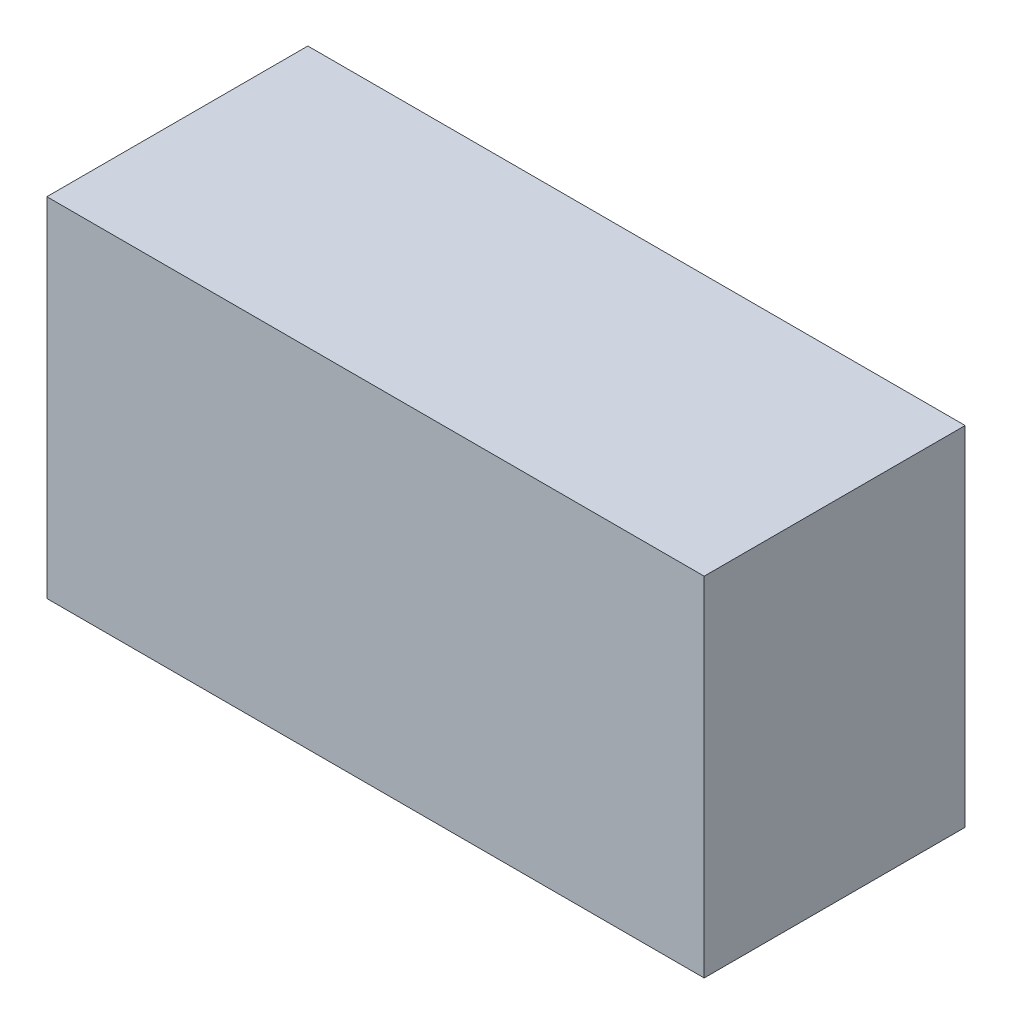
ISO-10303-21;
HEADER;
FILE_DESCRIPTION(('STEP AP214'),'2;1');
FILE_NAME('part.step','',(''),(''),'','','');
FILE_SCHEMA(('AUTOMOTIVE_DESIGN { 1 0 10303 214 1 1 1 1 }'));
ENDSEC;
DATA;
#1=APPLICATION_CONTEXT('core data for automotive mechanical design processes');
#2=APPLICATION_PROTOCOL_DEFINITION('international standard','automotive_design',2000,#1);
#3=PRODUCT_CONTEXT('',#1,'mechanical');
#4=PRODUCT('Part','Part','',(#3));
#5=PRODUCT_RELATED_PRODUCT_CATEGORY('part','',(#4));
#6=PRODUCT_DEFINITION_FORMATION('','',#4);
#7=PRODUCT_DEFINITION_CONTEXT('part definition',#1,'design');
#8=PRODUCT_DEFINITION('design','',#6,#7);
#9=PRODUCT_DEFINITION_SHAPE('','',#8);
#10=(LENGTH_UNIT() NAMED_UNIT(*) SI_UNIT(.MILLI.,.METRE.));
#11=(NAMED_UNIT(*) PLANE_ANGLE_UNIT() SI_UNIT($,.RADIAN.));
#12=(NAMED_UNIT(*) SI_UNIT($,.STERADIAN.) SOLID_ANGLE_UNIT());
#13=UNCERTAINTY_MEASURE_WITH_UNIT(LENGTH_MEASURE(1.E-05),#10,'distance_accuracy_value','');
#14=(GEOMETRIC_REPRESENTATION_CONTEXT(3) GLOBAL_UNCERTAINTY_ASSIGNED_CONTEXT((#13)) GLOBAL_UNIT_ASSIGNED_CONTEXT((#10,
#11,#12)) REPRESENTATION_CONTEXT('',''));
#15=CARTESIAN_POINT('',(0.,0.,0.));
#16=DIRECTION('',(0.,0.,1.));
#17=DIRECTION('',(1.,0.,0.));
#18=AXIS2_PLACEMENT_3D('',#15,#16,#17);
#19=CARTESIAN_POINT('',(-1.69999914,-0.90000074,1.35));
#20=DIRECTION('',(0.,0.,-1.));
#21=DIRECTION('',(-1.,0.,0.));
#22=AXIS2_PLACEMENT_3D('',#19,#20,#21);
#23=PLANE('',#22);
#24=DIRECTION('',(0.,1.,0.));
#25=VECTOR('',#24,1.);
#26=CARTESIAN_POINT('',(1.69999914,-0.90000074,1.35));
#27=LINE('',#26,#25);
#28=CARTESIAN_POINT('',(1.69999914,-0.90000074,1.35));
#29=VERTEX_POINT('',#28);
#30=CARTESIAN_POINT('',(1.69999914,0.90000074,1.35));
#31=VERTEX_POINT('',#30);
#32=EDGE_CURVE('E79',#29,#31,#27,.T.);
#33=ORIENTED_EDGE('',*,*,#32,.T.);
#34=DIRECTION('',(1.,0.,0.));
#35=VECTOR('',#34,1.);
#36=CARTESIAN_POINT('',(1.69999914,0.90000074,1.35));
#37=LINE('',#36,#35);
#38=CARTESIAN_POINT('',(-1.69999914,0.90000074,1.35));
#39=VERTEX_POINT('',#38);
#40=EDGE_CURVE('E55',#31,#39,#37,.F.);
#41=ORIENTED_EDGE('',*,*,#40,.T.);
#42=DIRECTION('',(0.,1.,0.));
#43=VECTOR('',#42,1.);
#44=CARTESIAN_POINT('',(-1.69999914,0.90000074,1.35));
#45=LINE('',#44,#43);
#46=CARTESIAN_POINT('',(-1.69999914,-0.90000074,1.35));
#47=VERTEX_POINT('',#46);
#48=EDGE_CURVE('E57',#39,#47,#45,.F.);
#49=ORIENTED_EDGE('',*,*,#48,.T.);
#50=DIRECTION('',(1.,0.,0.));
#51=VECTOR('',#50,1.);
#52=CARTESIAN_POINT('',(-1.69999914,-0.90000074,1.35));
#53=LINE('',#52,#51);
#54=EDGE_CURVE('E20',#47,#29,#53,.T.);
#55=ORIENTED_EDGE('',*,*,#54,.T.);
#56=EDGE_LOOP('',(#33,#41,#49,#55));
#57=FACE_BOUND('',#56,.T.);
#58=ADVANCED_FACE('F17',(#57),#23,.F.);
#59=CARTESIAN_POINT('',(-1.69999914,-0.90000074,0.));
#60=DIRECTION('',(0.,1.,0.));
#61=DIRECTION('',(0.,0.,1.));
#62=AXIS2_PLACEMENT_3D('',#59,#60,#61);
#63=PLANE('',#62);
#64=DIRECTION('',(-1.,0.,0.));
#65=VECTOR('',#64,1.);
#66=CARTESIAN_POINT('',(-1.69999914,-0.90000074,0.));
#67=LINE('',#66,#65);
#68=CARTESIAN_POINT('',(1.69999914,-0.90000074,0.));
#69=VERTEX_POINT('',#68);
#70=CARTESIAN_POINT('',(-1.69999914,-0.90000074,0.));
#71=VERTEX_POINT('',#70);
#72=EDGE_CURVE('E83',#69,#71,#67,.T.);
#73=ORIENTED_EDGE('',*,*,#72,.F.);
#74=DIRECTION('',(0.,0.,1.));
#75=VECTOR('',#74,1.);
#76=CARTESIAN_POINT('',(1.69999914,-0.90000074,0.));
#77=LINE('',#76,#75);
#78=EDGE_CURVE('E68',#69,#29,#77,.T.);
#79=ORIENTED_EDGE('',*,*,#78,.T.);
#80=ORIENTED_EDGE('',*,*,#54,.F.);
#81=DIRECTION('',(0.,0.,-1.));
#82=VECTOR('',#81,1.);
#83=CARTESIAN_POINT('',(-1.69999914,-0.90000074,0.));
#84=LINE('',#83,#82);
#85=EDGE_CURVE('E63',#47,#71,#84,.T.);
#86=ORIENTED_EDGE('',*,*,#85,.T.);
#87=EDGE_LOOP('',(#73,#79,#80,#86));
#88=FACE_BOUND('',#87,.T.);
#89=ADVANCED_FACE('F65',(#88),#63,.F.);
#90=CARTESIAN_POINT('',(-1.69999914,0.90000074,0.));
#91=DIRECTION('',(1.,0.,0.));
#92=DIRECTION('',(0.,0.,-1.));
#93=AXIS2_PLACEMENT_3D('',#90,#91,#92);
#94=PLANE('',#93);
#95=DIRECTION('',(0.,1.,0.));
#96=VECTOR('',#95,1.);
#97=CARTESIAN_POINT('',(-1.69999914,-0.90000074,0.));
#98=LINE('',#97,#96);
#99=CARTESIAN_POINT('',(-1.69999914,0.90000074,0.));
#100=VERTEX_POINT('',#99);
#101=EDGE_CURVE('E72',#71,#100,#98,.T.);
#102=ORIENTED_EDGE('',*,*,#101,.F.);
#103=ORIENTED_EDGE('',*,*,#85,.F.);
#104=ORIENTED_EDGE('',*,*,#48,.F.);
#105=DIRECTION('',(0.,0.,-1.));
#106=VECTOR('',#105,1.);
#107=CARTESIAN_POINT('',(-1.69999914,0.90000074,0.));
#108=LINE('',#107,#106);
#109=EDGE_CURVE('E75',#39,#100,#108,.T.);
#110=ORIENTED_EDGE('',*,*,#109,.T.);
#111=EDGE_LOOP('',(#102,#103,#104,#110));
#112=FACE_BOUND('',#111,.T.);
#113=ADVANCED_FACE('F70',(#112),#94,.F.);
#114=CARTESIAN_POINT('',(1.69999914,0.90000074,0.));
#115=DIRECTION('',(0.,-1.,0.));
#116=DIRECTION('',(0.,0.,-1.));
#117=AXIS2_PLACEMENT_3D('',#114,#115,#116);
#118=PLANE('',#117);
#119=DIRECTION('',(-1.,0.,0.));
#120=VECTOR('',#119,1.);
#121=CARTESIAN_POINT('',(-1.69999914,0.90000074,0.));
#122=LINE('',#121,#120);
#123=CARTESIAN_POINT('',(1.69999914,0.90000074,0.));
#124=VERTEX_POINT('',#123);
#125=EDGE_CURVE('E26',#100,#124,#122,.F.);
#126=ORIENTED_EDGE('',*,*,#125,.F.);
#127=ORIENTED_EDGE('',*,*,#109,.F.);
#128=ORIENTED_EDGE('',*,*,#40,.F.);
#129=DIRECTION('',(0.,0.,1.));
#130=VECTOR('',#129,1.);
#131=CARTESIAN_POINT('',(1.69999914,0.90000074,0.));
#132=LINE('',#131,#130);
#133=EDGE_CURVE('E35',#31,#124,#132,.F.);
#134=ORIENTED_EDGE('',*,*,#133,.T.);
#135=EDGE_LOOP('',(#126,#127,#128,#134));
#136=FACE_BOUND('',#135,.T.);
#137=ADVANCED_FACE('F89',(#136),#118,.F.);
#138=CARTESIAN_POINT('',(1.69999914,-0.90000074,0.));
#139=DIRECTION('',(-1.,0.,0.));
#140=DIRECTION('',(0.,0.,1.));
#141=AXIS2_PLACEMENT_3D('',#138,#139,#140);
#142=PLANE('',#141);
#143=DIRECTION('',(0.,1.,0.));
#144=VECTOR('',#143,1.);
#145=CARTESIAN_POINT('',(1.69999914,-0.90000074,0.));
#146=LINE('',#145,#144);
#147=EDGE_CURVE('E11',#124,#69,#146,.F.);
#148=ORIENTED_EDGE('',*,*,#147,.F.);
#149=ORIENTED_EDGE('',*,*,#133,.F.);
#150=ORIENTED_EDGE('',*,*,#32,.F.);
#151=ORIENTED_EDGE('',*,*,#78,.F.);
#152=EDGE_LOOP('',(#148,#149,#150,#151));
#153=FACE_BOUND('',#152,.T.);
#154=ADVANCED_FACE('F91',(#153),#142,.F.);
#155=CARTESIAN_POINT('',(-1.69999914,-0.90000074,0.));
#156=DIRECTION('',(0.,0.,-1.));
#157=DIRECTION('',(-1.,0.,0.));
#158=AXIS2_PLACEMENT_3D('',#155,#156,#157);
#159=PLANE('',#158);
#160=ORIENTED_EDGE('',*,*,#125,.T.);
#161=ORIENTED_EDGE('',*,*,#147,.T.);
#162=ORIENTED_EDGE('',*,*,#72,.T.);
#163=ORIENTED_EDGE('',*,*,#101,.T.);
#164=EDGE_LOOP('',(#160,#161,#162,#163));
#165=FACE_BOUND('',#164,.T.);
#166=ADVANCED_FACE('F88',(#165),#159,.T.);
#167=CLOSED_SHELL('',(#58,#89,#113,#137,#154,#166));
#168=MANIFOLD_SOLID_BREP('B1',#167);
#169=ADVANCED_BREP_SHAPE_REPRESENTATION('',(#18,#168),#14);
#170=SHAPE_DEFINITION_REPRESENTATION(#9,#169);
ENDSEC;
END-ISO-10303-21;
